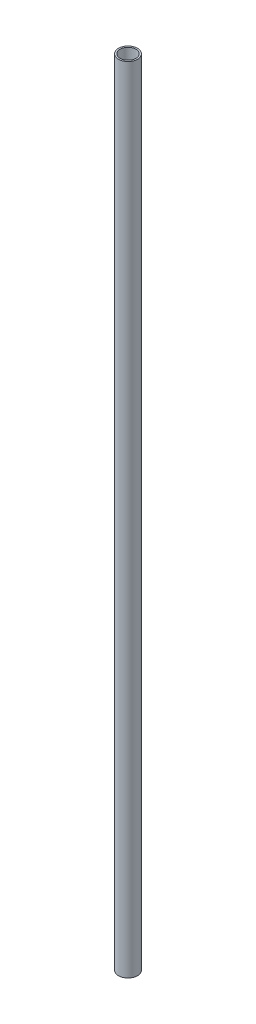
ISO-10303-21;
HEADER;
FILE_DESCRIPTION(('STEP AP214'),'2;1');
FILE_NAME('part.step','',(''),(''),'','','');
FILE_SCHEMA(('AUTOMOTIVE_DESIGN { 1 0 10303 214 1 1 1 1 }'));
ENDSEC;
DATA;
#1=APPLICATION_CONTEXT('core data for automotive mechanical design processes');
#2=APPLICATION_PROTOCOL_DEFINITION('international standard','automotive_design',2000,#1);
#3=PRODUCT_CONTEXT('',#1,'mechanical');
#4=PRODUCT('Part','Part','',(#3));
#5=PRODUCT_RELATED_PRODUCT_CATEGORY('part','',(#4));
#6=PRODUCT_DEFINITION_FORMATION('','',#4);
#7=PRODUCT_DEFINITION_CONTEXT('part definition',#1,'design');
#8=PRODUCT_DEFINITION('design','',#6,#7);
#9=PRODUCT_DEFINITION_SHAPE('','',#8);
#10=(LENGTH_UNIT() NAMED_UNIT(*) SI_UNIT(.MILLI.,.METRE.));
#11=(NAMED_UNIT(*) PLANE_ANGLE_UNIT() SI_UNIT($,.RADIAN.));
#12=(NAMED_UNIT(*) SI_UNIT($,.STERADIAN.) SOLID_ANGLE_UNIT());
#13=UNCERTAINTY_MEASURE_WITH_UNIT(LENGTH_MEASURE(1.E-05),#10,'distance_accuracy_value','');
#14=(GEOMETRIC_REPRESENTATION_CONTEXT(3) GLOBAL_UNCERTAINTY_ASSIGNED_CONTEXT((#13)) GLOBAL_UNIT_ASSIGNED_CONTEXT((#10,
#11,#12)) REPRESENTATION_CONTEXT('',''));
#15=CARTESIAN_POINT('',(0.,0.,0.));
#16=DIRECTION('',(0.,0.,1.));
#17=DIRECTION('',(1.,0.,0.));
#18=AXIS2_PLACEMENT_3D('',#15,#16,#17);
#19=CARTESIAN_POINT('',(0.,500.,0.));
#20=DIRECTION('',(0.,1.,0.));
#21=DIRECTION('',(0.,0.,1.));
#22=AXIS2_PLACEMENT_3D('',#19,#20,#21);
#23=PLANE('',#22);
#24=CARTESIAN_POINT('',(0.,500.,0.));
#25=DIRECTION('',(0.,1.,0.));
#26=DIRECTION('',(0.,0.,1.));
#27=AXIS2_PLACEMENT_3D('',#24,#25,#26);
#28=CIRCLE('',#27,6.);
#29=CARTESIAN_POINT('',(0.,500.,6.));
#30=VERTEX_POINT('',#29);
#31=EDGE_CURVE('E10',#30,#30,#28,.T.);
#32=ORIENTED_EDGE('',*,*,#31,.T.);
#33=EDGE_LOOP('',(#32));
#34=FACE_BOUND('',#33,.T.);
#35=CARTESIAN_POINT('',(0.,500.,0.));
#36=DIRECTION('',(0.,1.,0.));
#37=DIRECTION('',(0.,0.,1.));
#38=AXIS2_PLACEMENT_3D('',#35,#36,#37);
#39=CIRCLE('',#38,5.);
#40=CARTESIAN_POINT('',(0.,500.,5.));
#41=VERTEX_POINT('',#40);
#42=EDGE_CURVE('E42',#41,#41,#39,.T.);
#43=ORIENTED_EDGE('',*,*,#42,.F.);
#44=EDGE_LOOP('',(#43));
#45=FACE_BOUND('',#44,.T.);
#46=ADVANCED_FACE('F31',(#34,#45),#23,.T.);
#47=CARTESIAN_POINT('',(0.,0.,0.));
#48=DIRECTION('',(0.,1.,0.));
#49=DIRECTION('',(0.,0.,1.));
#50=AXIS2_PLACEMENT_3D('',#47,#48,#49);
#51=PLANE('',#50);
#52=CARTESIAN_POINT('',(0.,0.,0.));
#53=DIRECTION('',(0.,1.,0.));
#54=DIRECTION('',(0.,0.,1.));
#55=AXIS2_PLACEMENT_3D('',#52,#53,#54);
#56=CIRCLE('',#55,6.);
#57=CARTESIAN_POINT('',(0.,0.,6.));
#58=VERTEX_POINT('',#57);
#59=EDGE_CURVE('E35',#58,#58,#56,.T.);
#60=ORIENTED_EDGE('',*,*,#59,.F.);
#61=EDGE_LOOP('',(#60));
#62=FACE_BOUND('',#61,.T.);
#63=CARTESIAN_POINT('',(0.,0.,0.));
#64=DIRECTION('',(0.,1.,0.));
#65=DIRECTION('',(0.,0.,1.));
#66=AXIS2_PLACEMENT_3D('',#63,#64,#65);
#67=CIRCLE('',#66,5.);
#68=CARTESIAN_POINT('',(0.,0.,5.));
#69=VERTEX_POINT('',#68);
#70=EDGE_CURVE('E44',#69,#69,#67,.T.);
#71=ORIENTED_EDGE('',*,*,#70,.T.);
#72=EDGE_LOOP('',(#71));
#73=FACE_BOUND('',#72,.T.);
#74=ADVANCED_FACE('F54',(#62,#73),#51,.F.);
#75=CARTESIAN_POINT('',(0.,500.,0.));
#76=DIRECTION('',(0.,-1.,0.));
#77=DIRECTION('',(0.,0.,-1.));
#78=AXIS2_PLACEMENT_3D('',#75,#76,#77);
#79=CYLINDRICAL_SURFACE('',#78,6.);
#80=ORIENTED_EDGE('',*,*,#31,.F.);
#81=EDGE_LOOP('',(#80));
#82=FACE_BOUND('',#81,.T.);
#83=ORIENTED_EDGE('',*,*,#59,.T.);
#84=EDGE_LOOP('',(#83));
#85=FACE_BOUND('',#84,.T.);
#86=ADVANCED_FACE('F33',(#82,#85),#79,.T.);
#87=CARTESIAN_POINT('',(0.,500.,0.));
#88=DIRECTION('',(0.,-1.,0.));
#89=DIRECTION('',(0.,0.,-1.));
#90=AXIS2_PLACEMENT_3D('',#87,#88,#89);
#91=CYLINDRICAL_SURFACE('',#90,5.);
#92=ORIENTED_EDGE('',*,*,#42,.T.);
#93=EDGE_LOOP('',(#92));
#94=FACE_BOUND('',#93,.T.);
#95=ORIENTED_EDGE('',*,*,#70,.F.);
#96=EDGE_LOOP('',(#95));
#97=FACE_BOUND('',#96,.T.);
#98=ADVANCED_FACE('F50',(#94,#97),#91,.F.);
#99=CLOSED_SHELL('',(#46,#74,#86,#98));
#100=MANIFOLD_SOLID_BREP('B2',#99);
#101=ADVANCED_BREP_SHAPE_REPRESENTATION('',(#18,#100),#14);
#102=SHAPE_DEFINITION_REPRESENTATION(#9,#101);
ENDSEC;
END-ISO-10303-21;
